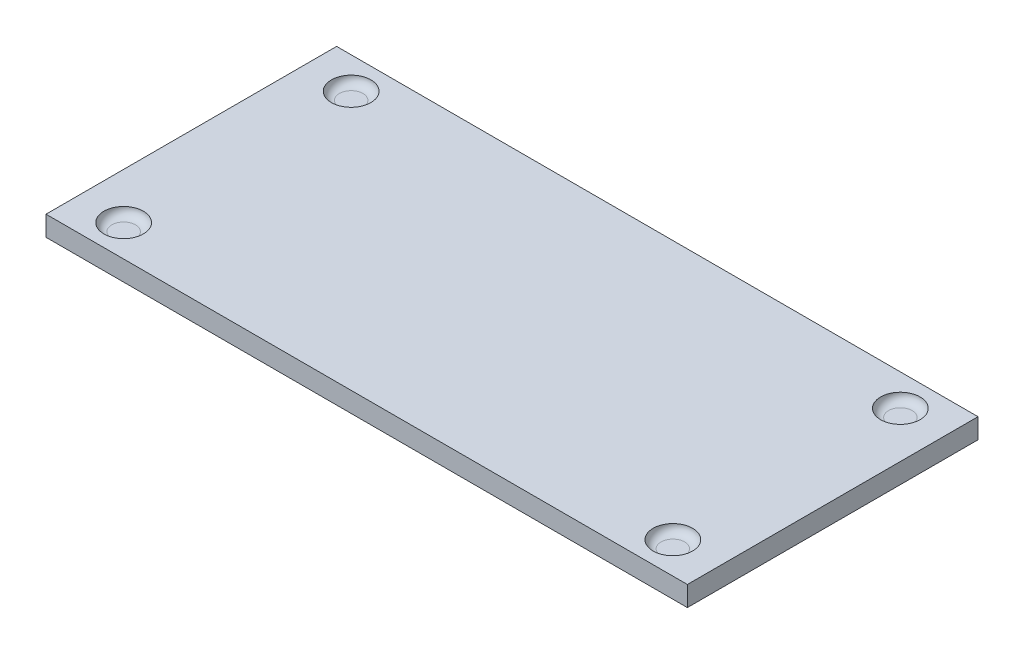
ISO-10303-21;
HEADER;
FILE_DESCRIPTION(('STEP AP214'),'2;1');
FILE_NAME('part.step','',(''),(''),'','','');
FILE_SCHEMA(('AUTOMOTIVE_DESIGN { 1 0 10303 214 1 1 1 1 }'));
ENDSEC;
DATA;
#1=APPLICATION_CONTEXT('core data for automotive mechanical design processes');
#2=APPLICATION_PROTOCOL_DEFINITION('international standard','automotive_design',2000,#1);
#3=PRODUCT_CONTEXT('',#1,'mechanical');
#4=PRODUCT('Part','Part','',(#3));
#5=PRODUCT_RELATED_PRODUCT_CATEGORY('part','',(#4));
#6=PRODUCT_DEFINITION_FORMATION('','',#4);
#7=PRODUCT_DEFINITION_CONTEXT('part definition',#1,'design');
#8=PRODUCT_DEFINITION('design','',#6,#7);
#9=PRODUCT_DEFINITION_SHAPE('','',#8);
#10=(LENGTH_UNIT() NAMED_UNIT(*) SI_UNIT(.MILLI.,.METRE.));
#11=(NAMED_UNIT(*) PLANE_ANGLE_UNIT() SI_UNIT($,.RADIAN.));
#12=(NAMED_UNIT(*) SI_UNIT($,.STERADIAN.) SOLID_ANGLE_UNIT());
#13=UNCERTAINTY_MEASURE_WITH_UNIT(LENGTH_MEASURE(1.E-05),#10,'distance_accuracy_value','');
#14=(GEOMETRIC_REPRESENTATION_CONTEXT(3) GLOBAL_UNCERTAINTY_ASSIGNED_CONTEXT((#13)) GLOBAL_UNIT_ASSIGNED_CONTEXT((#10,
#11,#12)) REPRESENTATION_CONTEXT('',''));
#15=CARTESIAN_POINT('',(0.,0.,0.));
#16=DIRECTION('',(0.,0.,1.));
#17=DIRECTION('',(1.,0.,0.));
#18=AXIS2_PLACEMENT_3D('',#15,#16,#17);
#19=CARTESIAN_POINT('',(0.,12.7,-184.15));
#20=DIRECTION('',(0.,0.,-1.));
#21=DIRECTION('',(-1.,0.,0.));
#22=AXIS2_PLACEMENT_3D('',#19,#20,#21);
#23=PLANE('',#22);
#24=DIRECTION('',(1.,0.,0.));
#25=VECTOR('',#24,1.);
#26=CARTESIAN_POINT('',(0.,0.,-184.15));
#27=LINE('',#26,#25);
#28=CARTESIAN_POINT('',(0.,0.,-184.15));
#29=VERTEX_POINT('',#28);
#30=CARTESIAN_POINT('',(406.4,0.,-184.15));
#31=VERTEX_POINT('',#30);
#32=EDGE_CURVE('E118',#29,#31,#27,.T.);
#33=ORIENTED_EDGE('',*,*,#32,.F.);
#34=DIRECTION('',(0.,-1.,0.));
#35=VECTOR('',#34,1.);
#36=CARTESIAN_POINT('',(0.,12.7,-184.15));
#37=LINE('',#36,#35);
#38=CARTESIAN_POINT('',(0.,12.7,-184.15));
#39=VERTEX_POINT('',#38);
#40=EDGE_CURVE('E66',#39,#29,#37,.T.);
#41=ORIENTED_EDGE('',*,*,#40,.F.);
#42=DIRECTION('',(1.,0.,0.));
#43=VECTOR('',#42,1.);
#44=CARTESIAN_POINT('',(0.,12.7,-184.15));
#45=LINE('',#44,#43);
#46=CARTESIAN_POINT('',(406.4,12.7,-184.15));
#47=VERTEX_POINT('',#46);
#48=EDGE_CURVE('E111',#39,#47,#45,.T.);
#49=ORIENTED_EDGE('',*,*,#48,.T.);
#50=DIRECTION('',(0.,-1.,0.));
#51=VECTOR('',#50,1.);
#52=CARTESIAN_POINT('',(406.4,12.7,-184.15));
#53=LINE('',#52,#51);
#54=EDGE_CURVE('E108',#47,#31,#53,.T.);
#55=ORIENTED_EDGE('',*,*,#54,.T.);
#56=EDGE_LOOP('',(#33,#41,#49,#55));
#57=FACE_BOUND('',#56,.T.);
#58=ADVANCED_FACE('F49',(#57),#23,.T.);
#59=CARTESIAN_POINT('',(0.,12.7,0.));
#60=DIRECTION('',(-1.,0.,0.));
#61=DIRECTION('',(0.,0.,1.));
#62=AXIS2_PLACEMENT_3D('',#59,#60,#61);
#63=PLANE('',#62);
#64=DIRECTION('',(0.,0.,-1.));
#65=VECTOR('',#64,1.);
#66=CARTESIAN_POINT('',(0.,0.,0.));
#67=LINE('',#66,#65);
#68=CARTESIAN_POINT('',(0.,0.,0.));
#69=VERTEX_POINT('',#68);
#70=EDGE_CURVE('E113',#69,#29,#67,.T.);
#71=ORIENTED_EDGE('',*,*,#70,.F.);
#72=DIRECTION('',(0.,-1.,0.));
#73=VECTOR('',#72,1.);
#74=CARTESIAN_POINT('',(0.,12.7,0.));
#75=LINE('',#74,#73);
#76=CARTESIAN_POINT('',(0.,12.7,0.));
#77=VERTEX_POINT('',#76);
#78=EDGE_CURVE('E82',#77,#69,#75,.T.);
#79=ORIENTED_EDGE('',*,*,#78,.F.);
#80=DIRECTION('',(0.,0.,-1.));
#81=VECTOR('',#80,1.);
#82=CARTESIAN_POINT('',(0.,12.7,0.));
#83=LINE('',#82,#81);
#84=EDGE_CURVE('E99',#77,#39,#83,.T.);
#85=ORIENTED_EDGE('',*,*,#84,.T.);
#86=ORIENTED_EDGE('',*,*,#40,.T.);
#87=EDGE_LOOP('',(#71,#79,#85,#86));
#88=FACE_BOUND('',#87,.T.);
#89=ADVANCED_FACE('F154',(#88),#63,.T.);
#90=CARTESIAN_POINT('',(0.,12.7,0.));
#91=DIRECTION('',(0.,0.,-1.));
#92=DIRECTION('',(-1.,0.,0.));
#93=AXIS2_PLACEMENT_3D('',#90,#91,#92);
#94=PLANE('',#93);
#95=DIRECTION('',(1.,0.,0.));
#96=VECTOR('',#95,1.);
#97=CARTESIAN_POINT('',(0.,0.,0.));
#98=LINE('',#97,#96);
#99=CARTESIAN_POINT('',(406.4,0.,0.));
#100=VERTEX_POINT('',#99);
#101=EDGE_CURVE('E104',#69,#100,#98,.T.);
#102=ORIENTED_EDGE('',*,*,#101,.T.);
#103=DIRECTION('',(0.,-1.,0.));
#104=VECTOR('',#103,1.);
#105=CARTESIAN_POINT('',(406.4,12.7,0.));
#106=LINE('',#105,#104);
#107=CARTESIAN_POINT('',(406.4,12.7,0.));
#108=VERTEX_POINT('',#107);
#109=EDGE_CURVE('E102',#108,#100,#106,.T.);
#110=ORIENTED_EDGE('',*,*,#109,.F.);
#111=DIRECTION('',(1.,0.,0.));
#112=VECTOR('',#111,1.);
#113=CARTESIAN_POINT('',(0.,12.7,0.));
#114=LINE('',#113,#112);
#115=EDGE_CURVE('E96',#77,#108,#114,.T.);
#116=ORIENTED_EDGE('',*,*,#115,.F.);
#117=ORIENTED_EDGE('',*,*,#78,.T.);
#118=EDGE_LOOP('',(#102,#110,#116,#117));
#119=FACE_BOUND('',#118,.T.);
#120=ADVANCED_FACE('F103',(#119),#94,.F.);
#121=CARTESIAN_POINT('',(406.4,12.7,0.));
#122=DIRECTION('',(-1.,0.,0.));
#123=DIRECTION('',(0.,0.,1.));
#124=AXIS2_PLACEMENT_3D('',#121,#122,#123);
#125=PLANE('',#124);
#126=DIRECTION('',(0.,0.,-1.));
#127=VECTOR('',#126,1.);
#128=CARTESIAN_POINT('',(406.4,0.,0.));
#129=LINE('',#128,#127);
#130=EDGE_CURVE('E121',#100,#31,#129,.T.);
#131=ORIENTED_EDGE('',*,*,#130,.T.);
#132=ORIENTED_EDGE('',*,*,#54,.F.);
#133=DIRECTION('',(0.,0.,-1.));
#134=VECTOR('',#133,1.);
#135=CARTESIAN_POINT('',(406.4,12.7,0.));
#136=LINE('',#135,#134);
#137=EDGE_CURVE('E93',#108,#47,#136,.T.);
#138=ORIENTED_EDGE('',*,*,#137,.F.);
#139=ORIENTED_EDGE('',*,*,#109,.T.);
#140=EDGE_LOOP('',(#131,#132,#138,#139));
#141=FACE_BOUND('',#140,.T.);
#142=ADVANCED_FACE('F110',(#141),#125,.F.);
#143=CARTESIAN_POINT('',(0.,12.7,0.));
#144=DIRECTION('',(0.,1.,0.));
#145=DIRECTION('',(0.,0.,1.));
#146=AXIS2_PLACEMENT_3D('',#143,#144,#145);
#147=PLANE('',#146);
#148=CARTESIAN_POINT('',(29.1955574919574,12.7,-164.15));
#149=DIRECTION('',(0.,1.,0.));
#150=DIRECTION('',(0.,0.,1.));
#151=AXIS2_PLACEMENT_3D('',#148,#149,#150);
#152=CIRCLE('',#151,12.5);
#153=CARTESIAN_POINT('',(29.1955574919574,12.7,-151.65));
#154=VERTEX_POINT('',#153);
#155=EDGE_CURVE('E276',#154,#154,#152,.T.);
#156=ORIENTED_EDGE('',*,*,#155,.F.);
#157=EDGE_LOOP('',(#156));
#158=FACE_BOUND('',#157,.T.);
#159=CARTESIAN_POINT('',(377.204442508043,12.7,-164.150000000001));
#160=DIRECTION('',(0.,1.,0.));
#161=DIRECTION('',(0.,0.,1.));
#162=AXIS2_PLACEMENT_3D('',#159,#160,#161);
#163=CIRCLE('',#162,12.5);
#164=CARTESIAN_POINT('',(377.204442508043,12.7,-151.650000000001));
#165=VERTEX_POINT('',#164);
#166=EDGE_CURVE('E175',#165,#165,#163,.T.);
#167=ORIENTED_EDGE('',*,*,#166,.F.);
#168=EDGE_LOOP('',(#167));
#169=FACE_BOUND('',#168,.T.);
#170=CARTESIAN_POINT('',(377.204442508043,12.7,-20.0000000000001));
#171=DIRECTION('',(0.,1.,0.));
#172=DIRECTION('',(0.,0.,1.));
#173=AXIS2_PLACEMENT_3D('',#170,#171,#172);
#174=CIRCLE('',#173,12.5);
#175=CARTESIAN_POINT('',(377.204442508043,12.7,-7.50000000000008));
#176=VERTEX_POINT('',#175);
#177=EDGE_CURVE('E281',#176,#176,#174,.T.);
#178=ORIENTED_EDGE('',*,*,#177,.F.);
#179=EDGE_LOOP('',(#178));
#180=FACE_BOUND('',#179,.T.);
#181=CARTESIAN_POINT('',(29.1955574919572,12.7,-19.9999999999995));
#182=DIRECTION('',(0.,1.,0.));
#183=DIRECTION('',(0.,0.,1.));
#184=AXIS2_PLACEMENT_3D('',#181,#182,#183);
#185=CIRCLE('',#184,12.5);
#186=CARTESIAN_POINT('',(29.1955574919572,12.7,-7.49999999999952));
#187=VERTEX_POINT('',#186);
#188=EDGE_CURVE('E122',#187,#187,#185,.T.);
#189=ORIENTED_EDGE('',*,*,#188,.F.);
#190=EDGE_LOOP('',(#189));
#191=FACE_BOUND('',#190,.T.);
#192=ORIENTED_EDGE('',*,*,#48,.F.);
#193=ORIENTED_EDGE('',*,*,#84,.F.);
#194=ORIENTED_EDGE('',*,*,#115,.T.);
#195=ORIENTED_EDGE('',*,*,#137,.T.);
#196=EDGE_LOOP('',(#192,#193,#194,#195));
#197=FACE_BOUND('',#196,.T.);
#198=ADVANCED_FACE('F98',(#158,#169,#180,#191,#197),#147,.T.);
#199=CARTESIAN_POINT('',(0.,0.,0.));
#200=DIRECTION('',(0.,1.,0.));
#201=DIRECTION('',(0.,0.,1.));
#202=AXIS2_PLACEMENT_3D('',#199,#200,#201);
#203=PLANE('',#202);
#204=ORIENTED_EDGE('',*,*,#32,.T.);
#205=ORIENTED_EDGE('',*,*,#130,.F.);
#206=ORIENTED_EDGE('',*,*,#101,.F.);
#207=ORIENTED_EDGE('',*,*,#70,.T.);
#208=EDGE_LOOP('',(#204,#205,#206,#207));
#209=FACE_BOUND('',#208,.T.);
#210=ADVANCED_FACE('F189',(#209),#203,.F.);
#211=CARTESIAN_POINT('',(0.,7.7,0.));
#212=DIRECTION('',(0.,1.,0.));
#213=DIRECTION('',(0.,0.,1.));
#214=AXIS2_PLACEMENT_3D('',#211,#212,#213);
#215=PLANE('',#214);
#216=CARTESIAN_POINT('',(29.1955574919572,7.7,-19.9999999999995));
#217=DIRECTION('',(0.,1.,0.));
#218=DIRECTION('',(0.,0.,1.));
#219=AXIS2_PLACEMENT_3D('',#216,#217,#218);
#220=CIRCLE('',#219,7.50000000000001);
#221=CARTESIAN_POINT('',(29.1955574919572,7.7,-12.4999999999995));
#222=VERTEX_POINT('',#221);
#223=EDGE_CURVE('E58',#222,#222,#220,.T.);
#224=ORIENTED_EDGE('',*,*,#223,.T.);
#225=EDGE_LOOP('',(#224));
#226=FACE_BOUND('',#225,.T.);
#227=ADVANCED_FACE('F138',(#226),#215,.T.);
#228=CARTESIAN_POINT('',(0.,7.7,0.));
#229=DIRECTION('',(0.,1.,0.));
#230=DIRECTION('',(0.,0.,1.));
#231=AXIS2_PLACEMENT_3D('',#228,#229,#230);
#232=PLANE('',#231);
#233=CARTESIAN_POINT('',(377.204442508043,7.7,-20.0000000000001));
#234=DIRECTION('',(0.,1.,0.));
#235=DIRECTION('',(0.,0.,1.));
#236=AXIS2_PLACEMENT_3D('',#233,#234,#235);
#237=CIRCLE('',#236,7.50000000000001);
#238=CARTESIAN_POINT('',(377.204442508043,7.7,-12.5000000000001));
#239=VERTEX_POINT('',#238);
#240=EDGE_CURVE('E133',#239,#239,#237,.T.);
#241=ORIENTED_EDGE('',*,*,#240,.T.);
#242=EDGE_LOOP('',(#241));
#243=FACE_BOUND('',#242,.T.);
#244=ADVANCED_FACE('F179',(#243),#232,.T.);
#245=CARTESIAN_POINT('',(0.,7.7,0.));
#246=DIRECTION('',(0.,1.,0.));
#247=DIRECTION('',(0.,0.,1.));
#248=AXIS2_PLACEMENT_3D('',#245,#246,#247);
#249=PLANE('',#248);
#250=CARTESIAN_POINT('',(377.204442508043,7.7,-164.150000000001));
#251=DIRECTION('',(0.,1.,0.));
#252=DIRECTION('',(0.,0.,1.));
#253=AXIS2_PLACEMENT_3D('',#250,#251,#252);
#254=CIRCLE('',#253,7.50000000000001);
#255=CARTESIAN_POINT('',(377.204442508043,7.7,-156.650000000001));
#256=VERTEX_POINT('',#255);
#257=EDGE_CURVE('E128',#256,#256,#254,.T.);
#258=ORIENTED_EDGE('',*,*,#257,.T.);
#259=EDGE_LOOP('',(#258));
#260=FACE_BOUND('',#259,.T.);
#261=ADVANCED_FACE('F169',(#260),#249,.T.);
#262=CARTESIAN_POINT('',(0.,7.7,0.));
#263=DIRECTION('',(0.,1.,0.));
#264=DIRECTION('',(0.,0.,1.));
#265=AXIS2_PLACEMENT_3D('',#262,#263,#264);
#266=PLANE('',#265);
#267=CARTESIAN_POINT('',(29.1955574919574,7.7,-164.15));
#268=DIRECTION('',(0.,1.,0.));
#269=DIRECTION('',(0.,0.,1.));
#270=AXIS2_PLACEMENT_3D('',#267,#268,#269);
#271=CIRCLE('',#270,7.5);
#272=CARTESIAN_POINT('',(29.1955574919574,7.7,-156.65));
#273=VERTEX_POINT('',#272);
#274=EDGE_CURVE('E13',#273,#273,#271,.T.);
#275=ORIENTED_EDGE('',*,*,#274,.T.);
#276=EDGE_LOOP('',(#275));
#277=FACE_BOUND('',#276,.T.);
#278=ADVANCED_FACE('F164',(#277),#266,.T.);
#279=CARTESIAN_POINT('',(377.204442508043,12.7,-164.150000000001));
#280=DIRECTION('',(0.,1.,0.));
#281=DIRECTION('',(0.,0.,1.));
#282=AXIS2_PLACEMENT_3D('',#279,#280,#281);
#283=TOROIDAL_SURFACE('',#282,7.50000000000001,5.);
#284=ORIENTED_EDGE('',*,*,#166,.T.);
#285=EDGE_LOOP('',(#284));
#286=FACE_BOUND('',#285,.T.);
#287=ORIENTED_EDGE('',*,*,#257,.F.);
#288=EDGE_LOOP('',(#287));
#289=FACE_BOUND('',#288,.T.);
#290=ADVANCED_FACE('F149',(#286,#289),#283,.F.);
#291=CARTESIAN_POINT('',(377.204442508043,12.7,-20.0000000000001));
#292=DIRECTION('',(0.,1.,0.));
#293=DIRECTION('',(0.,0.,1.));
#294=AXIS2_PLACEMENT_3D('',#291,#292,#293);
#295=TOROIDAL_SURFACE('',#294,7.50000000000001,5.);
#296=ORIENTED_EDGE('',*,*,#177,.T.);
#297=EDGE_LOOP('',(#296));
#298=FACE_BOUND('',#297,.T.);
#299=ORIENTED_EDGE('',*,*,#240,.F.);
#300=EDGE_LOOP('',(#299));
#301=FACE_BOUND('',#300,.T.);
#302=ADVANCED_FACE('F142',(#298,#301),#295,.F.);
#303=CARTESIAN_POINT('',(29.1955574919572,12.7,-19.9999999999995));
#304=DIRECTION('',(0.,1.,0.));
#305=DIRECTION('',(0.,0.,1.));
#306=AXIS2_PLACEMENT_3D('',#303,#304,#305);
#307=TOROIDAL_SURFACE('',#306,7.50000000000001,5.);
#308=ORIENTED_EDGE('',*,*,#188,.T.);
#309=EDGE_LOOP('',(#308));
#310=FACE_BOUND('',#309,.T.);
#311=ORIENTED_EDGE('',*,*,#223,.F.);
#312=EDGE_LOOP('',(#311));
#313=FACE_BOUND('',#312,.T.);
#314=ADVANCED_FACE('F140',(#310,#313),#307,.F.);
#315=CARTESIAN_POINT('',(29.1955574919574,12.7,-164.15));
#316=DIRECTION('',(0.,1.,0.));
#317=DIRECTION('',(0.,0.,1.));
#318=AXIS2_PLACEMENT_3D('',#315,#316,#317);
#319=TOROIDAL_SURFACE('',#318,7.5,5.);
#320=ORIENTED_EDGE('',*,*,#155,.T.);
#321=EDGE_LOOP('',(#320));
#322=FACE_BOUND('',#321,.T.);
#323=ORIENTED_EDGE('',*,*,#274,.F.);
#324=EDGE_LOOP('',(#323));
#325=FACE_BOUND('',#324,.T.);
#326=ADVANCED_FACE('F51',(#322,#325),#319,.F.);
#327=CLOSED_SHELL('',(#58,#89,#120,#142,#198,#210,#227,#244,#261,#278,#290,#302,#314,#326));
#328=MANIFOLD_SOLID_BREP('B2',#327);
#329=ADVANCED_BREP_SHAPE_REPRESENTATION('',(#18,#328),#14);
#330=SHAPE_DEFINITION_REPRESENTATION(#9,#329);
ENDSEC;
END-ISO-10303-21;
